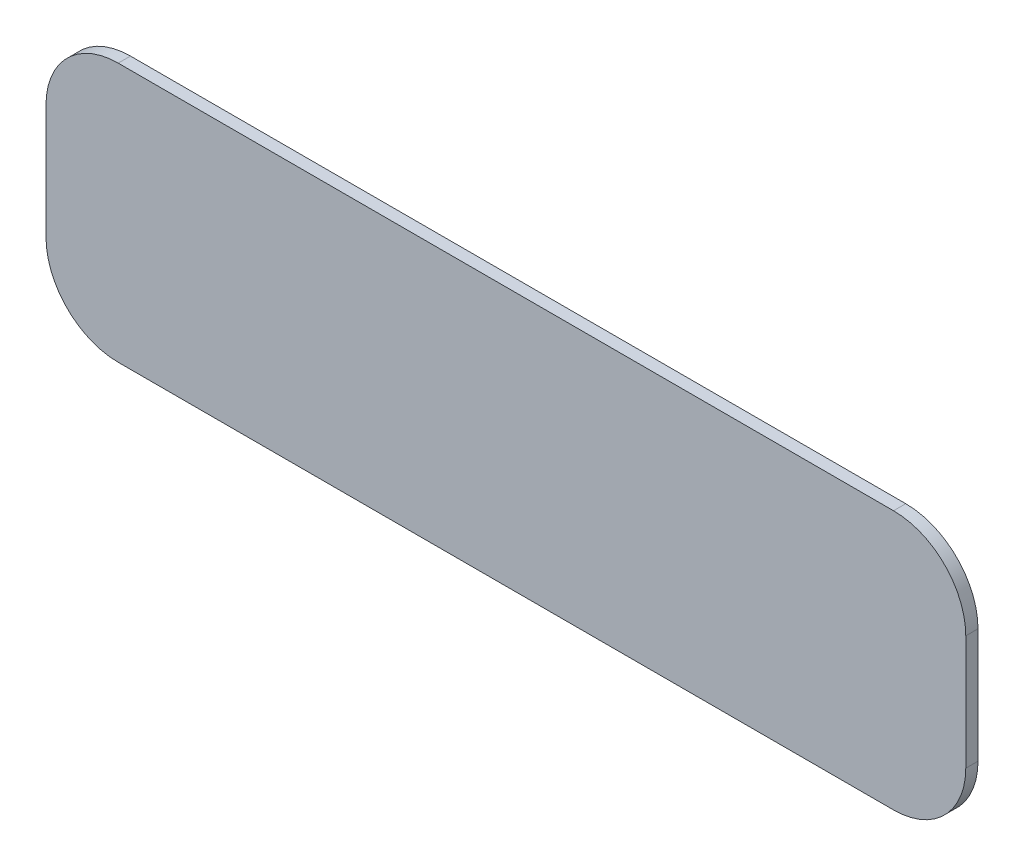
ISO-10303-21;
HEADER;
FILE_DESCRIPTION(('STEP AP214'),'2;1');
FILE_NAME('part.step','',(''),(''),'','','');
FILE_SCHEMA(('AUTOMOTIVE_DESIGN { 1 0 10303 214 1 1 1 1 }'));
ENDSEC;
DATA;
#1=APPLICATION_CONTEXT('core data for automotive mechanical design processes');
#2=APPLICATION_PROTOCOL_DEFINITION('international standard','automotive_design',2000,#1);
#3=PRODUCT_CONTEXT('',#1,'mechanical');
#4=PRODUCT('Part','Part','',(#3));
#5=PRODUCT_RELATED_PRODUCT_CATEGORY('part','',(#4));
#6=PRODUCT_DEFINITION_FORMATION('','',#4);
#7=PRODUCT_DEFINITION_CONTEXT('part definition',#1,'design');
#8=PRODUCT_DEFINITION('design','',#6,#7);
#9=PRODUCT_DEFINITION_SHAPE('','',#8);
#10=(LENGTH_UNIT() NAMED_UNIT(*) SI_UNIT(.MILLI.,.METRE.));
#11=(NAMED_UNIT(*) PLANE_ANGLE_UNIT() SI_UNIT($,.RADIAN.));
#12=(NAMED_UNIT(*) SI_UNIT($,.STERADIAN.) SOLID_ANGLE_UNIT());
#13=UNCERTAINTY_MEASURE_WITH_UNIT(LENGTH_MEASURE(1.E-05),#10,'distance_accuracy_value','');
#14=(GEOMETRIC_REPRESENTATION_CONTEXT(3) GLOBAL_UNCERTAINTY_ASSIGNED_CONTEXT((#13)) GLOBAL_UNIT_ASSIGNED_CONTEXT((#10,
#11,#12)) REPRESENTATION_CONTEXT('',''));
#15=CARTESIAN_POINT('',(0.,0.,0.));
#16=DIRECTION('',(0.,0.,1.));
#17=DIRECTION('',(1.,0.,0.));
#18=AXIS2_PLACEMENT_3D('',#15,#16,#17);
#19=CARTESIAN_POINT('',(95.,14.05,3.));
#20=DIRECTION('',(0.,0.,-1.));
#21=DIRECTION('',(-1.,0.,0.));
#22=AXIS2_PLACEMENT_3D('',#19,#20,#21);
#23=CYLINDRICAL_SURFACE('',#22,17.7);
#24=CARTESIAN_POINT('',(95.,14.05,0.));
#25=DIRECTION('',(0.,0.,1.));
#26=DIRECTION('',(-1.,0.,0.));
#27=AXIS2_PLACEMENT_3D('',#24,#25,#26);
#28=CIRCLE('',#27,17.7);
#29=CARTESIAN_POINT('',(112.7,14.0499999999999,0.));
#30=VERTEX_POINT('',#29);
#31=CARTESIAN_POINT('',(94.9999999999999,31.75,0.));
#32=VERTEX_POINT('',#31);
#33=EDGE_CURVE('E133',#30,#32,#28,.T.);
#34=ORIENTED_EDGE('',*,*,#33,.T.);
#35=DIRECTION('',(0.,0.,-1.));
#36=VECTOR('',#35,1.);
#37=CARTESIAN_POINT('',(94.9999999999999,31.75,3.));
#38=LINE('',#37,#36);
#39=CARTESIAN_POINT('',(94.9999999999999,31.75,3.));
#40=VERTEX_POINT('',#39);
#41=EDGE_CURVE('E11',#40,#32,#38,.T.);
#42=ORIENTED_EDGE('',*,*,#41,.F.);
#43=CARTESIAN_POINT('',(95.,14.05,3.));
#44=DIRECTION('',(0.,0.,1.));
#45=DIRECTION('',(-1.,0.,0.));
#46=AXIS2_PLACEMENT_3D('',#43,#44,#45);
#47=CIRCLE('',#46,17.7);
#48=CARTESIAN_POINT('',(112.7,14.0499999999999,3.));
#49=VERTEX_POINT('',#48);
#50=EDGE_CURVE('E147',#49,#40,#47,.T.);
#51=ORIENTED_EDGE('',*,*,#50,.F.);
#52=DIRECTION('',(0.,0.,-1.));
#53=VECTOR('',#52,1.);
#54=CARTESIAN_POINT('',(112.7,14.0499999999999,3.));
#55=LINE('',#54,#53);
#56=EDGE_CURVE('E129',#49,#30,#55,.T.);
#57=ORIENTED_EDGE('',*,*,#56,.T.);
#58=EDGE_LOOP('',(#34,#42,#51,#57));
#59=FACE_BOUND('',#58,.T.);
#60=ADVANCED_FACE('F37',(#59),#23,.T.);
#61=CARTESIAN_POINT('',(-94.9999999999999,31.75,3.));
#62=DIRECTION('',(0.,-1.,0.));
#63=DIRECTION('',(0.,0.,-1.));
#64=AXIS2_PLACEMENT_3D('',#61,#62,#63);
#65=PLANE('',#64);
#66=DIRECTION('',(-1.,0.,0.));
#67=VECTOR('',#66,1.);
#68=CARTESIAN_POINT('',(-94.9999999999999,31.75,0.));
#69=LINE('',#68,#67);
#70=CARTESIAN_POINT('',(-94.9999999999999,31.75,0.));
#71=VERTEX_POINT('',#70);
#72=EDGE_CURVE('E136',#32,#71,#69,.T.);
#73=ORIENTED_EDGE('',*,*,#72,.T.);
#74=DIRECTION('',(0.,0.,-1.));
#75=VECTOR('',#74,1.);
#76=CARTESIAN_POINT('',(-94.9999999999999,31.75,3.));
#77=LINE('',#76,#75);
#78=CARTESIAN_POINT('',(-94.9999999999999,31.75,3.));
#79=VERTEX_POINT('',#78);
#80=EDGE_CURVE('E45',#79,#71,#77,.T.);
#81=ORIENTED_EDGE('',*,*,#80,.F.);
#82=DIRECTION('',(-1.,0.,0.));
#83=VECTOR('',#82,1.);
#84=CARTESIAN_POINT('',(-94.9999999999999,31.75,3.));
#85=LINE('',#84,#83);
#86=EDGE_CURVE('E96',#40,#79,#85,.T.);
#87=ORIENTED_EDGE('',*,*,#86,.F.);
#88=ORIENTED_EDGE('',*,*,#41,.T.);
#89=EDGE_LOOP('',(#73,#81,#87,#88));
#90=FACE_BOUND('',#89,.T.);
#91=ADVANCED_FACE('F182',(#90),#65,.F.);
#92=CARTESIAN_POINT('',(-95.,14.05,3.));
#93=DIRECTION('',(0.,0.,-1.));
#94=DIRECTION('',(-1.,0.,0.));
#95=AXIS2_PLACEMENT_3D('',#92,#93,#94);
#96=CYLINDRICAL_SURFACE('',#95,17.7);
#97=CARTESIAN_POINT('',(-95.,14.05,0.));
#98=DIRECTION('',(0.,0.,1.));
#99=DIRECTION('',(-1.,0.,0.));
#100=AXIS2_PLACEMENT_3D('',#97,#98,#99);
#101=CIRCLE('',#100,17.7);
#102=CARTESIAN_POINT('',(-112.7,14.0499999999999,0.));
#103=VERTEX_POINT('',#102);
#104=EDGE_CURVE('E138',#71,#103,#101,.T.);
#105=ORIENTED_EDGE('',*,*,#104,.T.);
#106=DIRECTION('',(0.,0.,-1.));
#107=VECTOR('',#106,1.);
#108=CARTESIAN_POINT('',(-112.7,14.0499999999999,3.));
#109=LINE('',#108,#107);
#110=CARTESIAN_POINT('',(-112.7,14.0499999999999,3.));
#111=VERTEX_POINT('',#110);
#112=EDGE_CURVE('E154',#111,#103,#109,.T.);
#113=ORIENTED_EDGE('',*,*,#112,.F.);
#114=CARTESIAN_POINT('',(-95.,14.05,3.));
#115=DIRECTION('',(0.,0.,1.));
#116=DIRECTION('',(-1.,0.,0.));
#117=AXIS2_PLACEMENT_3D('',#114,#115,#116);
#118=CIRCLE('',#117,17.7);
#119=EDGE_CURVE('E162',#79,#111,#118,.T.);
#120=ORIENTED_EDGE('',*,*,#119,.F.);
#121=ORIENTED_EDGE('',*,*,#80,.T.);
#122=EDGE_LOOP('',(#105,#113,#120,#121));
#123=FACE_BOUND('',#122,.T.);
#124=ADVANCED_FACE('F160',(#123),#96,.T.);
#125=CARTESIAN_POINT('',(-112.7,-14.0499999999999,3.));
#126=DIRECTION('',(1.,0.,0.));
#127=DIRECTION('',(0.,0.,-1.));
#128=AXIS2_PLACEMENT_3D('',#125,#126,#127);
#129=PLANE('',#128);
#130=DIRECTION('',(0.,-1.,0.));
#131=VECTOR('',#130,1.);
#132=CARTESIAN_POINT('',(-112.7,-14.0499999999999,0.));
#133=LINE('',#132,#131);
#134=CARTESIAN_POINT('',(-112.7,-14.0499999999999,0.));
#135=VERTEX_POINT('',#134);
#136=EDGE_CURVE('E140',#103,#135,#133,.T.);
#137=ORIENTED_EDGE('',*,*,#136,.T.);
#138=DIRECTION('',(0.,0.,-1.));
#139=VECTOR('',#138,1.);
#140=CARTESIAN_POINT('',(-112.7,-14.0499999999999,3.));
#141=LINE('',#140,#139);
#142=CARTESIAN_POINT('',(-112.7,-14.0499999999999,3.));
#143=VERTEX_POINT('',#142);
#144=EDGE_CURVE('E151',#143,#135,#141,.T.);
#145=ORIENTED_EDGE('',*,*,#144,.F.);
#146=DIRECTION('',(0.,-1.,0.));
#147=VECTOR('',#146,1.);
#148=CARTESIAN_POINT('',(-112.7,-14.0499999999999,3.));
#149=LINE('',#148,#147);
#150=EDGE_CURVE('E174',#111,#143,#149,.T.);
#151=ORIENTED_EDGE('',*,*,#150,.F.);
#152=ORIENTED_EDGE('',*,*,#112,.T.);
#153=EDGE_LOOP('',(#137,#145,#151,#152));
#154=FACE_BOUND('',#153,.T.);
#155=ADVANCED_FACE('F170',(#154),#129,.F.);
#156=CARTESIAN_POINT('',(-95.,-14.05,3.));
#157=DIRECTION('',(0.,0.,-1.));
#158=DIRECTION('',(-1.,0.,0.));
#159=AXIS2_PLACEMENT_3D('',#156,#157,#158);
#160=CYLINDRICAL_SURFACE('',#159,17.7);
#161=CARTESIAN_POINT('',(-95.,-14.05,0.));
#162=DIRECTION('',(0.,0.,1.));
#163=DIRECTION('',(-1.,0.,0.));
#164=AXIS2_PLACEMENT_3D('',#161,#162,#163);
#165=CIRCLE('',#164,17.7);
#166=CARTESIAN_POINT('',(-94.9999999999999,-31.75,0.));
#167=VERTEX_POINT('',#166);
#168=EDGE_CURVE('E142',#135,#167,#165,.T.);
#169=ORIENTED_EDGE('',*,*,#168,.T.);
#170=DIRECTION('',(0.,0.,-1.));
#171=VECTOR('',#170,1.);
#172=CARTESIAN_POINT('',(-94.9999999999999,-31.75,3.));
#173=LINE('',#172,#171);
#174=CARTESIAN_POINT('',(-94.9999999999999,-31.75,3.));
#175=VERTEX_POINT('',#174);
#176=EDGE_CURVE('E124',#175,#167,#173,.T.);
#177=ORIENTED_EDGE('',*,*,#176,.F.);
#178=CARTESIAN_POINT('',(-95.,-14.05,3.));
#179=DIRECTION('',(0.,0.,1.));
#180=DIRECTION('',(-1.,0.,0.));
#181=AXIS2_PLACEMENT_3D('',#178,#179,#180);
#182=CIRCLE('',#181,17.7);
#183=EDGE_CURVE('E115',#143,#175,#182,.T.);
#184=ORIENTED_EDGE('',*,*,#183,.F.);
#185=ORIENTED_EDGE('',*,*,#144,.T.);
#186=EDGE_LOOP('',(#169,#177,#184,#185));
#187=FACE_BOUND('',#186,.T.);
#188=ADVANCED_FACE('F173',(#187),#160,.T.);
#189=CARTESIAN_POINT('',(-94.9999999999999,-31.75,3.));
#190=DIRECTION('',(0.,1.,0.));
#191=DIRECTION('',(0.,0.,1.));
#192=AXIS2_PLACEMENT_3D('',#189,#190,#191);
#193=PLANE('',#192);
#194=DIRECTION('',(1.,0.,0.));
#195=VECTOR('',#194,1.);
#196=CARTESIAN_POINT('',(-94.9999999999999,-31.75,0.));
#197=LINE('',#196,#195);
#198=CARTESIAN_POINT('',(94.9999999999999,-31.75,0.));
#199=VERTEX_POINT('',#198);
#200=EDGE_CURVE('E123',#167,#199,#197,.T.);
#201=ORIENTED_EDGE('',*,*,#200,.T.);
#202=DIRECTION('',(0.,0.,-1.));
#203=VECTOR('',#202,1.);
#204=CARTESIAN_POINT('',(94.9999999999999,-31.75,3.));
#205=LINE('',#204,#203);
#206=CARTESIAN_POINT('',(94.9999999999999,-31.75,3.));
#207=VERTEX_POINT('',#206);
#208=EDGE_CURVE('E120',#207,#199,#205,.T.);
#209=ORIENTED_EDGE('',*,*,#208,.F.);
#210=DIRECTION('',(1.,0.,0.));
#211=VECTOR('',#210,1.);
#212=CARTESIAN_POINT('',(-94.9999999999999,-31.75,3.));
#213=LINE('',#212,#211);
#214=EDGE_CURVE('E109',#175,#207,#213,.T.);
#215=ORIENTED_EDGE('',*,*,#214,.F.);
#216=ORIENTED_EDGE('',*,*,#176,.T.);
#217=EDGE_LOOP('',(#201,#209,#215,#216));
#218=FACE_BOUND('',#217,.T.);
#219=ADVANCED_FACE('F121',(#218),#193,.F.);
#220=CARTESIAN_POINT('',(95.,-14.05,3.));
#221=DIRECTION('',(0.,0.,-1.));
#222=DIRECTION('',(-1.,0.,0.));
#223=AXIS2_PLACEMENT_3D('',#220,#221,#222);
#224=CYLINDRICAL_SURFACE('',#223,17.7);
#225=CARTESIAN_POINT('',(95.,-14.05,0.));
#226=DIRECTION('',(0.,0.,1.));
#227=DIRECTION('',(1.,0.,0.));
#228=AXIS2_PLACEMENT_3D('',#225,#226,#227);
#229=CIRCLE('',#228,17.7);
#230=CARTESIAN_POINT('',(112.7,-14.05,0.));
#231=VERTEX_POINT('',#230);
#232=EDGE_CURVE('E82',#199,#231,#229,.T.);
#233=ORIENTED_EDGE('',*,*,#232,.T.);
#234=DIRECTION('',(0.,0.,-1.));
#235=VECTOR('',#234,1.);
#236=CARTESIAN_POINT('',(112.7,-14.05,3.));
#237=LINE('',#236,#235);
#238=CARTESIAN_POINT('',(112.7,-14.05,3.));
#239=VERTEX_POINT('',#238);
#240=EDGE_CURVE('E125',#239,#231,#237,.T.);
#241=ORIENTED_EDGE('',*,*,#240,.F.);
#242=CARTESIAN_POINT('',(95.,-14.05,3.));
#243=DIRECTION('',(0.,0.,1.));
#244=DIRECTION('',(1.,0.,0.));
#245=AXIS2_PLACEMENT_3D('',#242,#243,#244);
#246=CIRCLE('',#245,17.7);
#247=EDGE_CURVE('E113',#207,#239,#246,.T.);
#248=ORIENTED_EDGE('',*,*,#247,.F.);
#249=ORIENTED_EDGE('',*,*,#208,.T.);
#250=EDGE_LOOP('',(#233,#241,#248,#249));
#251=FACE_BOUND('',#250,.T.);
#252=ADVANCED_FACE('F127',(#251),#224,.T.);
#253=CARTESIAN_POINT('',(112.7,-14.0499999999999,3.));
#254=DIRECTION('',(-1.,0.,0.));
#255=DIRECTION('',(0.,0.,1.));
#256=AXIS2_PLACEMENT_3D('',#253,#254,#255);
#257=PLANE('',#256);
#258=DIRECTION('',(0.,1.,0.));
#259=VECTOR('',#258,1.);
#260=CARTESIAN_POINT('',(112.7,-14.0499999999999,0.));
#261=LINE('',#260,#259);
#262=EDGE_CURVE('E88',#231,#30,#261,.T.);
#263=ORIENTED_EDGE('',*,*,#262,.T.);
#264=ORIENTED_EDGE('',*,*,#56,.F.);
#265=DIRECTION('',(0.,1.,0.));
#266=VECTOR('',#265,1.);
#267=CARTESIAN_POINT('',(112.7,-14.0499999999999,3.));
#268=LINE('',#267,#266);
#269=EDGE_CURVE('E53',#239,#49,#268,.T.);
#270=ORIENTED_EDGE('',*,*,#269,.F.);
#271=ORIENTED_EDGE('',*,*,#240,.T.);
#272=EDGE_LOOP('',(#263,#264,#270,#271));
#273=FACE_BOUND('',#272,.T.);
#274=ADVANCED_FACE('F198',(#273),#257,.F.);
#275=CARTESIAN_POINT('',(95.,14.05,3.));
#276=DIRECTION('',(0.,0.,-1.));
#277=DIRECTION('',(-1.,0.,0.));
#278=AXIS2_PLACEMENT_3D('',#275,#276,#277);
#279=PLANE('',#278);
#280=ORIENTED_EDGE('',*,*,#50,.T.);
#281=ORIENTED_EDGE('',*,*,#86,.T.);
#282=ORIENTED_EDGE('',*,*,#119,.T.);
#283=ORIENTED_EDGE('',*,*,#150,.T.);
#284=ORIENTED_EDGE('',*,*,#183,.T.);
#285=ORIENTED_EDGE('',*,*,#214,.T.);
#286=ORIENTED_EDGE('',*,*,#247,.T.);
#287=ORIENTED_EDGE('',*,*,#269,.T.);
#288=EDGE_LOOP('',(#280,#281,#282,#283,#284,#285,#286,#287));
#289=FACE_BOUND('',#288,.T.);
#290=ADVANCED_FACE('F111',(#289),#279,.F.);
#291=CARTESIAN_POINT('',(95.,14.05,0.));
#292=DIRECTION('',(0.,0.,-1.));
#293=DIRECTION('',(-1.,0.,0.));
#294=AXIS2_PLACEMENT_3D('',#291,#292,#293);
#295=PLANE('',#294);
#296=ORIENTED_EDGE('',*,*,#33,.F.);
#297=ORIENTED_EDGE('',*,*,#262,.F.);
#298=ORIENTED_EDGE('',*,*,#232,.F.);
#299=ORIENTED_EDGE('',*,*,#200,.F.);
#300=ORIENTED_EDGE('',*,*,#168,.F.);
#301=ORIENTED_EDGE('',*,*,#136,.F.);
#302=ORIENTED_EDGE('',*,*,#104,.F.);
#303=ORIENTED_EDGE('',*,*,#72,.F.);
#304=EDGE_LOOP('',(#296,#297,#298,#299,#300,#301,#302,#303));
#305=FACE_BOUND('',#304,.T.);
#306=ADVANCED_FACE('F166',(#305),#295,.T.);
#307=CLOSED_SHELL('',(#60,#91,#124,#155,#188,#219,#252,#274,#290,#306));
#308=MANIFOLD_SOLID_BREP('B2',#307);
#309=ADVANCED_BREP_SHAPE_REPRESENTATION('',(#18,#308),#14);
#310=SHAPE_DEFINITION_REPRESENTATION(#9,#309);
ENDSEC;
END-ISO-10303-21;
